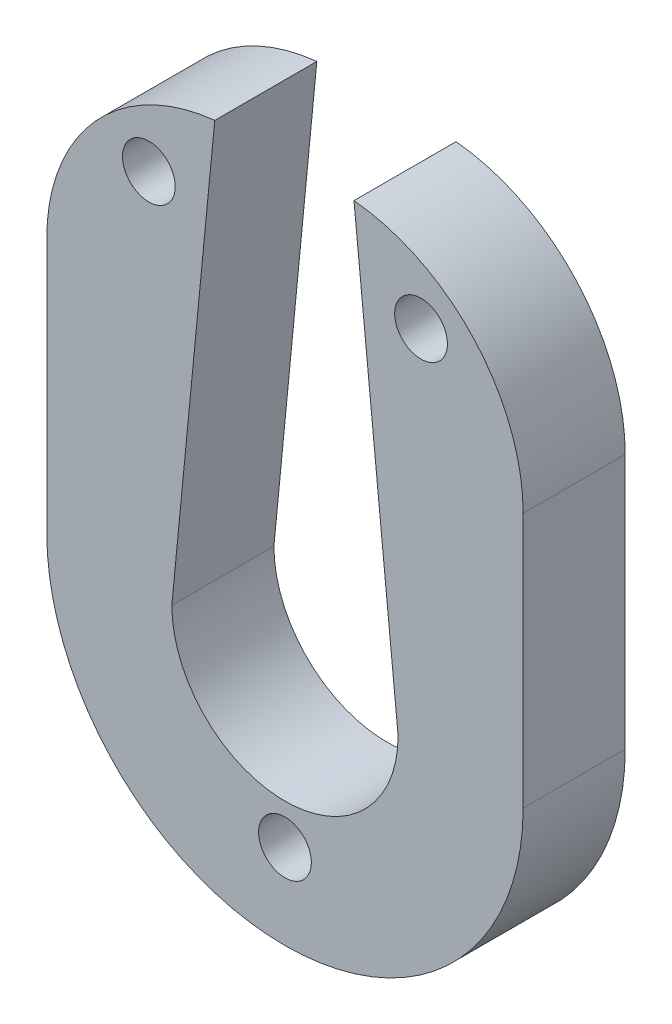
ISO-10303-21;
HEADER;
FILE_DESCRIPTION(('STEP AP214'),'2;1');
FILE_NAME('part.step','',(''),(''),'','','');
FILE_SCHEMA(('AUTOMOTIVE_DESIGN { 1 0 10303 214 1 1 1 1 }'));
ENDSEC;
DATA;
#1=APPLICATION_CONTEXT('core data for automotive mechanical design processes');
#2=APPLICATION_PROTOCOL_DEFINITION('international standard','automotive_design',2000,#1);
#3=PRODUCT_CONTEXT('',#1,'mechanical');
#4=PRODUCT('Part','Part','',(#3));
#5=PRODUCT_RELATED_PRODUCT_CATEGORY('part','',(#4));
#6=PRODUCT_DEFINITION_FORMATION('','',#4);
#7=PRODUCT_DEFINITION_CONTEXT('part definition',#1,'design');
#8=PRODUCT_DEFINITION('design','',#6,#7);
#9=PRODUCT_DEFINITION_SHAPE('','',#8);
#10=(LENGTH_UNIT() NAMED_UNIT(*) SI_UNIT(.MILLI.,.METRE.));
#11=(NAMED_UNIT(*) PLANE_ANGLE_UNIT() SI_UNIT($,.RADIAN.));
#12=(NAMED_UNIT(*) SI_UNIT($,.STERADIAN.) SOLID_ANGLE_UNIT());
#13=UNCERTAINTY_MEASURE_WITH_UNIT(LENGTH_MEASURE(1.E-05),#10,'distance_accuracy_value','');
#14=(GEOMETRIC_REPRESENTATION_CONTEXT(3) GLOBAL_UNCERTAINTY_ASSIGNED_CONTEXT((#13)) GLOBAL_UNIT_ASSIGNED_CONTEXT((#10,
#11,#12)) REPRESENTATION_CONTEXT('',''));
#15=CARTESIAN_POINT('',(0.,0.,0.));
#16=DIRECTION('',(0.,0.,1.));
#17=DIRECTION('',(1.,0.,0.));
#18=AXIS2_PLACEMENT_3D('',#15,#16,#17);
#19=CARTESIAN_POINT('',(-191.181077779291,87.9248464768425,-6.));
#20=DIRECTION('',(0.,0.,1.));
#21=DIRECTION('',(1.,0.,0.));
#22=AXIS2_PLACEMENT_3D('',#19,#20,#21);
#23=CYLINDRICAL_SURFACE('',#22,11.);
#24=DIRECTION('',(0.,0.,1.));
#25=VECTOR('',#24,1.);
#26=CARTESIAN_POINT('',(-192.307290127532,98.8670421315852,-6.));
#27=LINE('',#26,#25);
#28=CARTESIAN_POINT('',(-192.307290127532,98.8670421315852,-6.));
#29=VERTEX_POINT('',#28);
#30=CARTESIAN_POINT('',(-192.307290127532,98.8670421315852,0.));
#31=VERTEX_POINT('',#30);
#32=EDGE_CURVE('E50',#29,#31,#27,.T.);
#33=ORIENTED_EDGE('',*,*,#32,.F.);
#34=CARTESIAN_POINT('',(-191.181077779291,87.9248464768425,-6.));
#35=DIRECTION('',(0.,0.,1.));
#36=DIRECTION('',(-1.,0.,0.));
#37=AXIS2_PLACEMENT_3D('',#34,#35,#36);
#38=CIRCLE('',#37,11.);
#39=CARTESIAN_POINT('',(-202.181077779291,87.9248464768424,-6.));
#40=VERTEX_POINT('',#39);
#41=EDGE_CURVE('E83',#29,#40,#38,.T.);
#42=ORIENTED_EDGE('',*,*,#41,.T.);
#43=DIRECTION('',(0.,0.,1.));
#44=VECTOR('',#43,1.);
#45=CARTESIAN_POINT('',(-202.181077779291,87.9248464768424,-6.));
#46=LINE('',#45,#44);
#47=CARTESIAN_POINT('',(-202.181077779291,87.9248464768424,0.));
#48=VERTEX_POINT('',#47);
#49=EDGE_CURVE('E37',#40,#48,#46,.T.);
#50=ORIENTED_EDGE('',*,*,#49,.T.);
#51=CARTESIAN_POINT('',(-191.181077779291,87.9248464768425,0.));
#52=DIRECTION('',(0.,0.,1.));
#53=DIRECTION('',(-1.,0.,0.));
#54=AXIS2_PLACEMENT_3D('',#51,#52,#53);
#55=CIRCLE('',#54,11.);
#56=EDGE_CURVE('E155',#31,#48,#55,.T.);
#57=ORIENTED_EDGE('',*,*,#56,.F.);
#58=EDGE_LOOP('',(#33,#42,#50,#57));
#59=FACE_BOUND('',#58,.T.);
#60=ADVANCED_FACE('F34',(#59),#23,.T.);
#61=CARTESIAN_POINT('',(-185.181077779291,87.9248464768425,-6.));
#62=DIRECTION('',(0.,0.,1.));
#63=DIRECTION('',(1.,0.,0.));
#64=AXIS2_PLACEMENT_3D('',#61,#62,#63);
#65=CYLINDRICAL_SURFACE('',#64,11.);
#66=DIRECTION('',(0.,0.,1.));
#67=VECTOR('',#66,1.);
#68=CARTESIAN_POINT('',(-184.124372491993,98.8739731057476,-6.));
#69=LINE('',#68,#67);
#70=CARTESIAN_POINT('',(-184.124372491993,98.8739731057475,0.));
#71=VERTEX_POINT('',#70);
#72=CARTESIAN_POINT('',(-184.124372491993,98.8739731057475,-6.));
#73=VERTEX_POINT('',#72);
#74=EDGE_CURVE('E137',#71,#73,#69,.F.);
#75=ORIENTED_EDGE('',*,*,#74,.F.);
#76=CARTESIAN_POINT('',(-185.181077779291,87.9248464768425,0.));
#77=DIRECTION('',(0.,0.,1.));
#78=DIRECTION('',(1.,0.,0.));
#79=AXIS2_PLACEMENT_3D('',#76,#77,#78);
#80=CIRCLE('',#79,11.);
#81=CARTESIAN_POINT('',(-174.181077779291,87.9248464768424,0.));
#82=VERTEX_POINT('',#81);
#83=EDGE_CURVE('E160',#82,#71,#80,.T.);
#84=ORIENTED_EDGE('',*,*,#83,.F.);
#85=DIRECTION('',(0.,0.,1.));
#86=VECTOR('',#85,1.);
#87=CARTESIAN_POINT('',(-174.181077779291,87.9248464768424,-6.));
#88=LINE('',#87,#86);
#89=CARTESIAN_POINT('',(-174.181077779291,87.9248464768424,-6.));
#90=VERTEX_POINT('',#89);
#91=EDGE_CURVE('E11',#90,#82,#88,.T.);
#92=ORIENTED_EDGE('',*,*,#91,.F.);
#93=CARTESIAN_POINT('',(-185.181077779291,87.9248464768425,-6.));
#94=DIRECTION('',(0.,0.,1.));
#95=DIRECTION('',(1.,0.,0.));
#96=AXIS2_PLACEMENT_3D('',#93,#94,#95);
#97=CIRCLE('',#96,11.);
#98=EDGE_CURVE('E168',#90,#73,#97,.T.);
#99=ORIENTED_EDGE('',*,*,#98,.T.);
#100=EDGE_LOOP('',(#75,#84,#92,#99));
#101=FACE_BOUND('',#100,.T.);
#102=ADVANCED_FACE('F193',(#101),#65,.T.);
#103=CARTESIAN_POINT('',(-174.181077779291,72.9248464768425,-6.));
#104=DIRECTION('',(1.,0.,0.));
#105=DIRECTION('',(0.,0.,-1.));
#106=AXIS2_PLACEMENT_3D('',#103,#104,#105);
#107=PLANE('',#106);
#108=DIRECTION('',(0.,1.,0.));
#109=VECTOR('',#108,1.);
#110=CARTESIAN_POINT('',(-174.181077779291,72.9248464768425,0.));
#111=LINE('',#110,#109);
#112=CARTESIAN_POINT('',(-174.181077779291,72.9248464768425,0.));
#113=VERTEX_POINT('',#112);
#114=EDGE_CURVE('E177',#113,#82,#111,.T.);
#115=ORIENTED_EDGE('',*,*,#114,.F.);
#116=DIRECTION('',(0.,0.,1.));
#117=VECTOR('',#116,1.);
#118=CARTESIAN_POINT('',(-174.181077779291,72.9248464768425,-6.));
#119=LINE('',#118,#117);
#120=CARTESIAN_POINT('',(-174.181077779291,72.9248464768425,-6.));
#121=VERTEX_POINT('',#120);
#122=EDGE_CURVE('E42',#121,#113,#119,.T.);
#123=ORIENTED_EDGE('',*,*,#122,.F.);
#124=DIRECTION('',(0.,1.,0.));
#125=VECTOR('',#124,1.);
#126=CARTESIAN_POINT('',(-174.181077779291,72.9248464768425,-6.));
#127=LINE('',#126,#125);
#128=EDGE_CURVE('E166',#121,#90,#127,.T.);
#129=ORIENTED_EDGE('',*,*,#128,.T.);
#130=ORIENTED_EDGE('',*,*,#91,.T.);
#131=EDGE_LOOP('',(#115,#123,#129,#130));
#132=FACE_BOUND('',#131,.T.);
#133=ADVANCED_FACE('F191',(#132),#107,.T.);
#134=CARTESIAN_POINT('',(-188.181077779291,72.9248464768425,-6.));
#135=DIRECTION('',(0.,0.,1.));
#136=DIRECTION('',(1.,0.,0.));
#137=AXIS2_PLACEMENT_3D('',#134,#135,#136);
#138=CYLINDRICAL_SURFACE('',#137,14.);
#139=CARTESIAN_POINT('',(-188.181077779291,72.9248464768425,0.));
#140=DIRECTION('',(0.,0.,1.));
#141=DIRECTION('',(1.,0.,0.));
#142=AXIS2_PLACEMENT_3D('',#139,#140,#141);
#143=CIRCLE('',#142,14.);
#144=CARTESIAN_POINT('',(-202.181077779291,72.9248464768425,0.));
#145=VERTEX_POINT('',#144);
#146=EDGE_CURVE('E174',#145,#113,#143,.T.);
#147=ORIENTED_EDGE('',*,*,#146,.F.);
#148=DIRECTION('',(0.,0.,1.));
#149=VECTOR('',#148,1.);
#150=CARTESIAN_POINT('',(-202.181077779291,72.9248464768425,-6.));
#151=LINE('',#150,#149);
#152=CARTESIAN_POINT('',(-202.181077779291,72.9248464768425,-6.));
#153=VERTEX_POINT('',#152);
#154=EDGE_CURVE('E181',#153,#145,#151,.T.);
#155=ORIENTED_EDGE('',*,*,#154,.F.);
#156=CARTESIAN_POINT('',(-188.181077779291,72.9248464768425,-6.));
#157=DIRECTION('',(0.,0.,1.));
#158=DIRECTION('',(1.,0.,0.));
#159=AXIS2_PLACEMENT_3D('',#156,#157,#158);
#160=CIRCLE('',#159,14.);
#161=EDGE_CURVE('E163',#153,#121,#160,.T.);
#162=ORIENTED_EDGE('',*,*,#161,.T.);
#163=ORIENTED_EDGE('',*,*,#122,.T.);
#164=EDGE_LOOP('',(#147,#155,#162,#163));
#165=FACE_BOUND('',#164,.T.);
#166=ADVANCED_FACE('F188',(#165),#138,.T.);
#167=CARTESIAN_POINT('',(-202.181077779291,72.9248464768425,-6.));
#168=DIRECTION('',(-1.,0.,0.));
#169=DIRECTION('',(0.,0.,1.));
#170=AXIS2_PLACEMENT_3D('',#167,#168,#169);
#171=PLANE('',#170);
#172=DIRECTION('',(0.,-1.,0.));
#173=VECTOR('',#172,1.);
#174=CARTESIAN_POINT('',(-202.181077779291,72.9248464768425,0.));
#175=LINE('',#174,#173);
#176=EDGE_CURVE('E171',#48,#145,#175,.T.);
#177=ORIENTED_EDGE('',*,*,#176,.F.);
#178=ORIENTED_EDGE('',*,*,#49,.F.);
#179=DIRECTION('',(0.,-1.,0.));
#180=VECTOR('',#179,1.);
#181=CARTESIAN_POINT('',(-202.181077779291,72.9248464768425,-6.));
#182=LINE('',#181,#180);
#183=EDGE_CURVE('E159',#40,#153,#182,.T.);
#184=ORIENTED_EDGE('',*,*,#183,.T.);
#185=ORIENTED_EDGE('',*,*,#154,.T.);
#186=EDGE_LOOP('',(#177,#178,#184,#185));
#187=FACE_BOUND('',#186,.T.);
#188=ADVANCED_FACE('F186',(#187),#171,.T.);
#189=CARTESIAN_POINT('',(-191.181077779291,87.9248464768425,-6.));
#190=DIRECTION('',(0.,0.,-1.));
#191=DIRECTION('',(-1.,0.,0.));
#192=AXIS2_PLACEMENT_3D('',#189,#190,#191);
#193=PLANE('',#192);
#194=DIRECTION('',(0.099503719022088,-0.99503719020988,0.));
#195=VECTOR('',#194,1.);
#196=CARTESIAN_POINT('',(-181.531097955694,72.9412277430412,-6.));
#197=LINE('',#196,#195);
#198=CARTESIAN_POINT('',(-181.531097955694,72.9412277430412,-6.));
#199=VERTEX_POINT('',#198);
#200=EDGE_CURVE('E127',#73,#199,#197,.T.);
#201=ORIENTED_EDGE('',*,*,#200,.F.);
#202=ORIENTED_EDGE('',*,*,#98,.F.);
#203=ORIENTED_EDGE('',*,*,#128,.F.);
#204=ORIENTED_EDGE('',*,*,#161,.F.);
#205=ORIENTED_EDGE('',*,*,#183,.F.);
#206=ORIENTED_EDGE('',*,*,#41,.F.);
#207=DIRECTION('',(0.0968222250737701,0.995301691313626,0.));
#208=VECTOR('',#207,1.);
#209=CARTESIAN_POINT('',(-191.970686269516,102.32722277637,-6.));
#210=LINE('',#209,#208);
#211=CARTESIAN_POINT('',(-194.831077601614,72.9233092793746,-6.));
#212=VERTEX_POINT('',#211);
#213=EDGE_CURVE('E129',#212,#29,#210,.T.);
#214=ORIENTED_EDGE('',*,*,#213,.F.);
#215=CARTESIAN_POINT('',(-188.181077779282,72.9248464769345,-6.));
#216=DIRECTION('',(0.,0.,-1.));
#217=DIRECTION('',(-1.,0.,0.));
#218=AXIS2_PLACEMENT_3D('',#215,#216,#217);
#219=CIRCLE('',#218,6.65000000000001);
#220=EDGE_CURVE('E115',#199,#212,#219,.T.);
#221=ORIENTED_EDGE('',*,*,#220,.F.);
#222=EDGE_LOOP('',(#201,#202,#203,#204,#205,#206,#214,#221));
#223=FACE_BOUND('',#222,.T.);
#224=CARTESIAN_POINT('',(-188.181077779291,63.9248464768425,-6.));
#225=DIRECTION('',(0.,0.,1.));
#226=DIRECTION('',(1.,0.,0.));
#227=AXIS2_PLACEMENT_3D('',#224,#225,#226);
#228=CIRCLE('',#227,1.54999999999999);
#229=CARTESIAN_POINT('',(-186.631077779291,63.9248464768425,-6.));
#230=VERTEX_POINT('',#229);
#231=EDGE_CURVE('E140',#230,#230,#228,.T.);
#232=ORIENTED_EDGE('',*,*,#231,.T.);
#233=EDGE_LOOP('',(#232));
#234=FACE_BOUND('',#233,.T.);
#235=CARTESIAN_POINT('',(-180.181077779291,94.3248197948837,-6.));
#236=DIRECTION('',(0.,0.,1.));
#237=DIRECTION('',(1.,0.,0.));
#238=AXIS2_PLACEMENT_3D('',#235,#236,#237);
#239=CIRCLE('',#238,1.55000000002475);
#240=CARTESIAN_POINT('',(-178.631077779266,94.3248197948837,-6.));
#241=VERTEX_POINT('',#240);
#242=EDGE_CURVE('E146',#241,#241,#239,.T.);
#243=ORIENTED_EDGE('',*,*,#242,.T.);
#244=EDGE_LOOP('',(#243));
#245=FACE_BOUND('',#244,.T.);
#246=CARTESIAN_POINT('',(-196.181077779291,94.3248197948837,-6.));
#247=DIRECTION('',(0.,0.,1.));
#248=DIRECTION('',(1.,0.,0.));
#249=AXIS2_PLACEMENT_3D('',#246,#247,#248);
#250=CIRCLE('',#249,1.55000000002475);
#251=CARTESIAN_POINT('',(-194.631077779266,94.3248197948837,-6.));
#252=VERTEX_POINT('',#251);
#253=EDGE_CURVE('E152',#252,#252,#250,.T.);
#254=ORIENTED_EDGE('',*,*,#253,.T.);
#255=EDGE_LOOP('',(#254));
#256=FACE_BOUND('',#255,.T.);
#257=ADVANCED_FACE('F215',(#223,#234,#245,#256),#193,.T.);
#258=CARTESIAN_POINT('',(-191.181077779291,87.9248464768425,0.));
#259=DIRECTION('',(0.,0.,-1.));
#260=DIRECTION('',(-1.,0.,0.));
#261=AXIS2_PLACEMENT_3D('',#258,#259,#260);
#262=PLANE('',#261);
#263=CARTESIAN_POINT('',(-188.181077779291,63.9248464768425,0.));
#264=DIRECTION('',(0.,0.,1.));
#265=DIRECTION('',(1.,0.,0.));
#266=AXIS2_PLACEMENT_3D('',#263,#264,#265);
#267=CIRCLE('',#266,1.54999999999999);
#268=CARTESIAN_POINT('',(-186.631077779291,63.9248464768425,0.));
#269=VERTEX_POINT('',#268);
#270=EDGE_CURVE('E139',#269,#269,#267,.T.);
#271=ORIENTED_EDGE('',*,*,#270,.F.);
#272=EDGE_LOOP('',(#271));
#273=FACE_BOUND('',#272,.T.);
#274=CARTESIAN_POINT('',(-180.181077779291,94.3248197948837,0.));
#275=DIRECTION('',(0.,0.,1.));
#276=DIRECTION('',(1.,0.,0.));
#277=AXIS2_PLACEMENT_3D('',#274,#275,#276);
#278=CIRCLE('',#277,1.55000000002475);
#279=CARTESIAN_POINT('',(-178.631077779266,94.3248197948837,0.));
#280=VERTEX_POINT('',#279);
#281=EDGE_CURVE('E143',#280,#280,#278,.T.);
#282=ORIENTED_EDGE('',*,*,#281,.F.);
#283=EDGE_LOOP('',(#282));
#284=FACE_BOUND('',#283,.T.);
#285=CARTESIAN_POINT('',(-196.181077779291,94.3248197948837,0.));
#286=DIRECTION('',(0.,0.,1.));
#287=DIRECTION('',(1.,0.,0.));
#288=AXIS2_PLACEMENT_3D('',#285,#286,#287);
#289=CIRCLE('',#288,1.55000000002475);
#290=CARTESIAN_POINT('',(-194.631077779266,94.3248197948837,0.));
#291=VERTEX_POINT('',#290);
#292=EDGE_CURVE('E149',#291,#291,#289,.T.);
#293=ORIENTED_EDGE('',*,*,#292,.F.);
#294=EDGE_LOOP('',(#293));
#295=FACE_BOUND('',#294,.T.);
#296=ORIENTED_EDGE('',*,*,#83,.T.);
#297=DIRECTION('',(0.099503719022088,-0.99503719020988,0.));
#298=VECTOR('',#297,1.);
#299=CARTESIAN_POINT('',(-181.531097955694,72.9412277430412,0.));
#300=LINE('',#299,#298);
#301=CARTESIAN_POINT('',(-181.531097955694,72.9412277430412,0.));
#302=VERTEX_POINT('',#301);
#303=EDGE_CURVE('E118',#71,#302,#300,.T.);
#304=ORIENTED_EDGE('',*,*,#303,.T.);
#305=CARTESIAN_POINT('',(-188.181077779282,72.9248464769345,0.));
#306=DIRECTION('',(0.,0.,-1.));
#307=DIRECTION('',(-1.,0.,0.));
#308=AXIS2_PLACEMENT_3D('',#305,#306,#307);
#309=CIRCLE('',#308,6.65000000000001);
#310=CARTESIAN_POINT('',(-194.831077601614,72.9233092793746,0.));
#311=VERTEX_POINT('',#310);
#312=EDGE_CURVE('E112',#302,#311,#309,.T.);
#313=ORIENTED_EDGE('',*,*,#312,.T.);
#314=DIRECTION('',(0.0968222250737701,0.995301691313626,0.));
#315=VECTOR('',#314,1.);
#316=CARTESIAN_POINT('',(-191.970686269516,102.32722277637,0.));
#317=LINE('',#316,#315);
#318=EDGE_CURVE('E120',#311,#31,#317,.T.);
#319=ORIENTED_EDGE('',*,*,#318,.T.);
#320=ORIENTED_EDGE('',*,*,#56,.T.);
#321=ORIENTED_EDGE('',*,*,#176,.T.);
#322=ORIENTED_EDGE('',*,*,#146,.T.);
#323=ORIENTED_EDGE('',*,*,#114,.T.);
#324=EDGE_LOOP('',(#296,#304,#313,#319,#320,#321,#322,#323));
#325=FACE_BOUND('',#324,.T.);
#326=ADVANCED_FACE('F126',(#273,#284,#295,#325),#262,.F.);
#327=CARTESIAN_POINT('',(-196.181077779291,94.3248197948837,-6.));
#328=DIRECTION('',(0.,0.,1.));
#329=DIRECTION('',(1.,0.,0.));
#330=AXIS2_PLACEMENT_3D('',#327,#328,#329);
#331=CYLINDRICAL_SURFACE('',#330,1.55000000002475);
#332=ORIENTED_EDGE('',*,*,#253,.F.);
#333=EDGE_LOOP('',(#332));
#334=FACE_BOUND('',#333,.T.);
#335=ORIENTED_EDGE('',*,*,#292,.T.);
#336=EDGE_LOOP('',(#335));
#337=FACE_BOUND('',#336,.T.);
#338=ADVANCED_FACE('F231',(#334,#337),#331,.F.);
#339=CARTESIAN_POINT('',(-180.181077779291,94.3248197948837,-6.));
#340=DIRECTION('',(0.,0.,1.));
#341=DIRECTION('',(1.,0.,0.));
#342=AXIS2_PLACEMENT_3D('',#339,#340,#341);
#343=CYLINDRICAL_SURFACE('',#342,1.55000000002475);
#344=ORIENTED_EDGE('',*,*,#242,.F.);
#345=EDGE_LOOP('',(#344));
#346=FACE_BOUND('',#345,.T.);
#347=ORIENTED_EDGE('',*,*,#281,.T.);
#348=EDGE_LOOP('',(#347));
#349=FACE_BOUND('',#348,.T.);
#350=ADVANCED_FACE('F269',(#346,#349),#343,.F.);
#351=CARTESIAN_POINT('',(-188.181077779291,63.9248464768425,-6.));
#352=DIRECTION('',(0.,0.,1.));
#353=DIRECTION('',(1.,0.,0.));
#354=AXIS2_PLACEMENT_3D('',#351,#352,#353);
#355=CYLINDRICAL_SURFACE('',#354,1.54999999999999);
#356=ORIENTED_EDGE('',*,*,#231,.F.);
#357=EDGE_LOOP('',(#356));
#358=FACE_BOUND('',#357,.T.);
#359=ORIENTED_EDGE('',*,*,#270,.T.);
#360=EDGE_LOOP('',(#359));
#361=FACE_BOUND('',#360,.T.);
#362=ADVANCED_FACE('F244',(#358,#361),#355,.F.);
#363=CARTESIAN_POINT('',(-188.181077779282,72.9248464769345,0.));
#364=DIRECTION('',(0.,0.,-1.));
#365=DIRECTION('',(-1.,0.,0.));
#366=AXIS2_PLACEMENT_3D('',#363,#364,#365);
#367=CYLINDRICAL_SURFACE('',#366,6.65000000000001);
#368=ORIENTED_EDGE('',*,*,#220,.T.);
#369=DIRECTION('',(0.,0.,-1.));
#370=VECTOR('',#369,1.);
#371=CARTESIAN_POINT('',(-194.831077601614,72.9233092793746,0.));
#372=LINE('',#371,#370);
#373=EDGE_CURVE('E108',#311,#212,#372,.T.);
#374=ORIENTED_EDGE('',*,*,#373,.F.);
#375=ORIENTED_EDGE('',*,*,#312,.F.);
#376=DIRECTION('',(0.,0.,-1.));
#377=VECTOR('',#376,1.);
#378=CARTESIAN_POINT('',(-181.531097955694,72.9412277430412,0.));
#379=LINE('',#378,#377);
#380=EDGE_CURVE('E117',#302,#199,#379,.T.);
#381=ORIENTED_EDGE('',*,*,#380,.T.);
#382=EDGE_LOOP('',(#368,#374,#375,#381));
#383=FACE_BOUND('',#382,.T.);
#384=ADVANCED_FACE('F109',(#383),#367,.F.);
#385=CARTESIAN_POINT('',(-181.531097955694,72.9412277430412,0.));
#386=DIRECTION('',(0.99503719020988,0.099503719022088,0.));
#387=DIRECTION('',(-0.0995037190220881,0.99503719020988,0.));
#388=AXIS2_PLACEMENT_3D('',#385,#386,#387);
#389=PLANE('',#388);
#390=ORIENTED_EDGE('',*,*,#74,.T.);
#391=ORIENTED_EDGE('',*,*,#200,.T.);
#392=ORIENTED_EDGE('',*,*,#380,.F.);
#393=ORIENTED_EDGE('',*,*,#303,.F.);
#394=EDGE_LOOP('',(#390,#391,#392,#393));
#395=FACE_BOUND('',#394,.T.);
#396=ADVANCED_FACE('F243',(#395),#389,.F.);
#397=CARTESIAN_POINT('',(-191.970686269516,102.32722277637,0.));
#398=DIRECTION('',(-0.995301691313626,0.0968222250737701,0.));
#399=DIRECTION('',(-0.0968222250737701,-0.995301691313626,0.));
#400=AXIS2_PLACEMENT_3D('',#397,#398,#399);
#401=PLANE('',#400);
#402=ORIENTED_EDGE('',*,*,#32,.T.);
#403=ORIENTED_EDGE('',*,*,#318,.F.);
#404=ORIENTED_EDGE('',*,*,#373,.T.);
#405=ORIENTED_EDGE('',*,*,#213,.T.);
#406=EDGE_LOOP('',(#402,#403,#404,#405));
#407=FACE_BOUND('',#406,.T.);
#408=ADVANCED_FACE('F121',(#407),#401,.F.);
#409=CLOSED_SHELL('',(#60,#102,#133,#166,#188,#257,#326,#338,#350,#362,#384,#396,#408));
#410=MANIFOLD_SOLID_BREP('B2',#409);
#411=ADVANCED_BREP_SHAPE_REPRESENTATION('',(#18,#410),#14);
#412=SHAPE_DEFINITION_REPRESENTATION(#9,#411);
ENDSEC;
END-ISO-10303-21;
